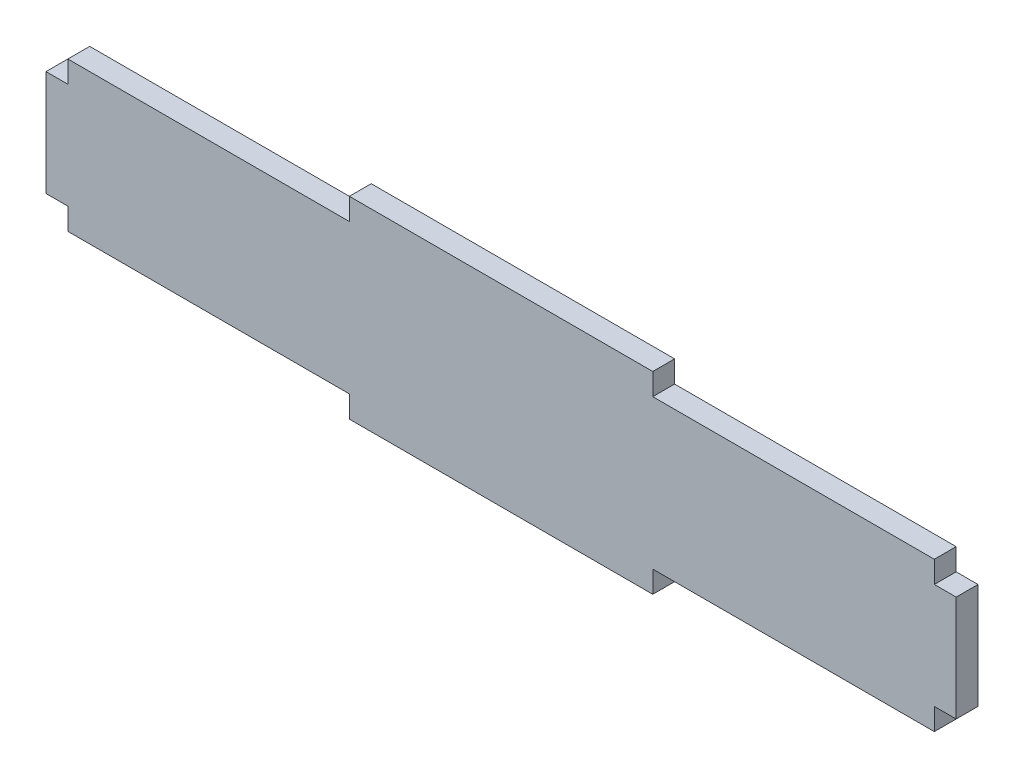
ISO-10303-21;
HEADER;
FILE_DESCRIPTION(('STEP AP214'),'2;1');
FILE_NAME('part.step','',(''),(''),'','','');
FILE_SCHEMA(('AUTOMOTIVE_DESIGN { 1 0 10303 214 1 1 1 1 }'));
ENDSEC;
DATA;
#1=APPLICATION_CONTEXT('core data for automotive mechanical design processes');
#2=APPLICATION_PROTOCOL_DEFINITION('international standard','automotive_design',2000,#1);
#3=PRODUCT_CONTEXT('',#1,'mechanical');
#4=PRODUCT('Part','Part','',(#3));
#5=PRODUCT_RELATED_PRODUCT_CATEGORY('part','',(#4));
#6=PRODUCT_DEFINITION_FORMATION('','',#4);
#7=PRODUCT_DEFINITION_CONTEXT('part definition',#1,'design');
#8=PRODUCT_DEFINITION('design','',#6,#7);
#9=PRODUCT_DEFINITION_SHAPE('','',#8);
#10=(LENGTH_UNIT() NAMED_UNIT(*) SI_UNIT(.MILLI.,.METRE.));
#11=(NAMED_UNIT(*) PLANE_ANGLE_UNIT() SI_UNIT($,.RADIAN.));
#12=(NAMED_UNIT(*) SI_UNIT($,.STERADIAN.) SOLID_ANGLE_UNIT());
#13=UNCERTAINTY_MEASURE_WITH_UNIT(LENGTH_MEASURE(1.E-05),#10,'distance_accuracy_value','');
#14=(GEOMETRIC_REPRESENTATION_CONTEXT(3) GLOBAL_UNCERTAINTY_ASSIGNED_CONTEXT((#13)) GLOBAL_UNIT_ASSIGNED_CONTEXT((#10,
#11,#12)) REPRESENTATION_CONTEXT('',''));
#15=CARTESIAN_POINT('',(0.,0.,0.));
#16=DIRECTION('',(0.,0.,1.));
#17=DIRECTION('',(1.,0.,0.));
#18=AXIS2_PLACEMENT_3D('',#15,#16,#17);
#19=CARTESIAN_POINT('',(125.,26.505,9.));
#20=DIRECTION('',(1.,0.,0.));
#21=DIRECTION('',(0.,0.,-1.));
#22=AXIS2_PLACEMENT_3D('',#19,#20,#21);
#23=PLANE('',#22);
#24=DIRECTION('',(0.,-1.,0.));
#25=VECTOR('',#24,1.);
#26=CARTESIAN_POINT('',(125.,26.505,9.));
#27=LINE('',#26,#25);
#28=CARTESIAN_POINT('',(125.,67.5149999999999,9.));
#29=VERTEX_POINT('',#28);
#30=CARTESIAN_POINT('',(125.,38.505,9.));
#31=VERTEX_POINT('',#30);
#32=EDGE_CURVE('E311',#29,#31,#27,.T.);
#33=ORIENTED_EDGE('',*,*,#32,.F.);
#34=DIRECTION('',(0.,0.,1.));
#35=VECTOR('',#34,1.);
#36=CARTESIAN_POINT('',(125.,67.5149999999999,3.));
#37=LINE('',#36,#35);
#38=CARTESIAN_POINT('',(125.,67.5149999999999,3.));
#39=VERTEX_POINT('',#38);
#40=EDGE_CURVE('E276',#39,#29,#37,.T.);
#41=ORIENTED_EDGE('',*,*,#40,.F.);
#42=DIRECTION('',(0.,-1.,0.));
#43=VECTOR('',#42,1.);
#44=CARTESIAN_POINT('',(125.,26.505,3.));
#45=LINE('',#44,#43);
#46=CARTESIAN_POINT('',(125.,38.505,3.));
#47=VERTEX_POINT('',#46);
#48=EDGE_CURVE('E309',#39,#47,#45,.T.);
#49=ORIENTED_EDGE('',*,*,#48,.T.);
#50=DIRECTION('',(0.,0.,1.));
#51=VECTOR('',#50,1.);
#52=CARTESIAN_POINT('',(125.,38.505,3.));
#53=LINE('',#52,#51);
#54=EDGE_CURVE('E280',#47,#31,#53,.T.);
#55=ORIENTED_EDGE('',*,*,#54,.T.);
#56=EDGE_LOOP('',(#33,#41,#49,#55));
#57=FACE_BOUND('',#56,.T.);
#58=ADVANCED_FACE('F34',(#57),#23,.F.);
#59=CARTESIAN_POINT('',(125.,26.505,9.));
#60=DIRECTION('',(0.,1.,0.));
#61=DIRECTION('',(0.,0.,1.));
#62=AXIS2_PLACEMENT_3D('',#59,#60,#61);
#63=PLANE('',#62);
#64=DIRECTION('',(1.,0.,0.));
#65=VECTOR('',#64,1.);
#66=CARTESIAN_POINT('',(125.,26.505,3.));
#67=LINE('',#66,#65);
#68=CARTESIAN_POINT('',(208.333333333333,26.505,3.));
#69=VERTEX_POINT('',#68);
#70=CARTESIAN_POINT('',(291.666666666667,26.505,3.));
#71=VERTEX_POINT('',#70);
#72=EDGE_CURVE('E321',#69,#71,#67,.T.);
#73=ORIENTED_EDGE('',*,*,#72,.T.);
#74=DIRECTION('',(0.,0.,1.));
#75=VECTOR('',#74,1.);
#76=CARTESIAN_POINT('',(291.666666666667,26.505,3.));
#77=LINE('',#76,#75);
#78=CARTESIAN_POINT('',(291.666666666667,26.505,9.));
#79=VERTEX_POINT('',#78);
#80=EDGE_CURVE('E177',#71,#79,#77,.T.);
#81=ORIENTED_EDGE('',*,*,#80,.T.);
#82=DIRECTION('',(1.,0.,0.));
#83=VECTOR('',#82,1.);
#84=CARTESIAN_POINT('',(125.,26.505,9.));
#85=LINE('',#84,#83);
#86=CARTESIAN_POINT('',(208.333333333333,26.505,9.));
#87=VERTEX_POINT('',#86);
#88=EDGE_CURVE('E314',#87,#79,#85,.T.);
#89=ORIENTED_EDGE('',*,*,#88,.F.);
#90=DIRECTION('',(0.,0.,1.));
#91=VECTOR('',#90,1.);
#92=CARTESIAN_POINT('',(208.333333333333,26.505,3.));
#93=LINE('',#92,#91);
#94=EDGE_CURVE('E241',#69,#87,#93,.T.);
#95=ORIENTED_EDGE('',*,*,#94,.F.);
#96=EDGE_LOOP('',(#73,#81,#89,#95));
#97=FACE_BOUND('',#96,.T.);
#98=ADVANCED_FACE('F369',(#97),#63,.F.);
#99=CARTESIAN_POINT('',(375.,26.505,9.));
#100=DIRECTION('',(-1.,0.,0.));
#101=DIRECTION('',(0.,0.,1.));
#102=AXIS2_PLACEMENT_3D('',#99,#100,#101);
#103=PLANE('',#102);
#104=DIRECTION('',(0.,1.,0.));
#105=VECTOR('',#104,1.);
#106=CARTESIAN_POINT('',(375.,26.505,3.));
#107=LINE('',#106,#105);
#108=CARTESIAN_POINT('',(375.,38.505,3.));
#109=VERTEX_POINT('',#108);
#110=CARTESIAN_POINT('',(375.,67.515,3.));
#111=VERTEX_POINT('',#110);
#112=EDGE_CURVE('E322',#109,#111,#107,.T.);
#113=ORIENTED_EDGE('',*,*,#112,.T.);
#114=DIRECTION('',(0.,0.,1.));
#115=VECTOR('',#114,1.);
#116=CARTESIAN_POINT('',(375.,67.515,3.));
#117=LINE('',#116,#115);
#118=CARTESIAN_POINT('',(375.,67.515,9.));
#119=VERTEX_POINT('',#118);
#120=EDGE_CURVE('E263',#111,#119,#117,.T.);
#121=ORIENTED_EDGE('',*,*,#120,.T.);
#122=DIRECTION('',(0.,1.,0.));
#123=VECTOR('',#122,1.);
#124=CARTESIAN_POINT('',(375.,26.505,9.));
#125=LINE('',#124,#123);
#126=CARTESIAN_POINT('',(375.,38.505,9.));
#127=VERTEX_POINT('',#126);
#128=EDGE_CURVE('E42',#127,#119,#125,.T.);
#129=ORIENTED_EDGE('',*,*,#128,.F.);
#130=DIRECTION('',(0.,0.,1.));
#131=VECTOR('',#130,1.);
#132=CARTESIAN_POINT('',(375.,38.505,3.));
#133=LINE('',#132,#131);
#134=EDGE_CURVE('E302',#109,#127,#133,.T.);
#135=ORIENTED_EDGE('',*,*,#134,.F.);
#136=EDGE_LOOP('',(#113,#121,#129,#135));
#137=FACE_BOUND('',#136,.T.);
#138=ADVANCED_FACE('F360',(#137),#103,.F.);
#139=CARTESIAN_POINT('',(125.,79.515,9.));
#140=DIRECTION('',(0.,-1.,0.));
#141=DIRECTION('',(0.,0.,-1.));
#142=AXIS2_PLACEMENT_3D('',#139,#140,#141);
#143=PLANE('',#142);
#144=DIRECTION('',(-1.,0.,0.));
#145=VECTOR('',#144,1.);
#146=CARTESIAN_POINT('',(125.,79.515,3.));
#147=LINE('',#146,#145);
#148=CARTESIAN_POINT('',(291.666666666667,79.5149999999999,3.));
#149=VERTEX_POINT('',#148);
#150=CARTESIAN_POINT('',(208.333333333333,79.5149999999999,3.));
#151=VERTEX_POINT('',#150);
#152=EDGE_CURVE('E37',#149,#151,#147,.T.);
#153=ORIENTED_EDGE('',*,*,#152,.T.);
#154=DIRECTION('',(0.,0.,1.));
#155=VECTOR('',#154,1.);
#156=CARTESIAN_POINT('',(208.333333333333,79.5149999999999,3.));
#157=LINE('',#156,#155);
#158=CARTESIAN_POINT('',(208.333333333333,79.5149999999999,9.));
#159=VERTEX_POINT('',#158);
#160=EDGE_CURVE('E196',#151,#159,#157,.T.);
#161=ORIENTED_EDGE('',*,*,#160,.T.);
#162=DIRECTION('',(-1.,0.,0.));
#163=VECTOR('',#162,1.);
#164=CARTESIAN_POINT('',(125.,79.515,9.));
#165=LINE('',#164,#163);
#166=CARTESIAN_POINT('',(291.666666666667,79.5149999999999,9.));
#167=VERTEX_POINT('',#166);
#168=EDGE_CURVE('E11',#167,#159,#165,.T.);
#169=ORIENTED_EDGE('',*,*,#168,.F.);
#170=DIRECTION('',(0.,0.,1.));
#171=VECTOR('',#170,1.);
#172=CARTESIAN_POINT('',(291.666666666667,79.5149999999999,3.));
#173=LINE('',#172,#171);
#174=EDGE_CURVE('E224',#149,#167,#173,.T.);
#175=ORIENTED_EDGE('',*,*,#174,.F.);
#176=EDGE_LOOP('',(#153,#161,#169,#175));
#177=FACE_BOUND('',#176,.T.);
#178=ADVANCED_FACE('F331',(#177),#143,.F.);
#179=CARTESIAN_POINT('',(125.,26.505,9.));
#180=DIRECTION('',(0.,0.,-1.));
#181=DIRECTION('',(-1.,0.,0.));
#182=AXIS2_PLACEMENT_3D('',#179,#180,#181);
#183=PLANE('',#182);
#184=ORIENTED_EDGE('',*,*,#88,.T.);
#185=DIRECTION('',(0.,-1.,0.));
#186=VECTOR('',#185,1.);
#187=CARTESIAN_POINT('',(291.666666666667,26.505,9.));
#188=LINE('',#187,#186);
#189=CARTESIAN_POINT('',(291.666666666667,32.505,9.));
#190=VERTEX_POINT('',#189);
#191=EDGE_CURVE('E192',#190,#79,#188,.T.);
#192=ORIENTED_EDGE('',*,*,#191,.F.);
#193=DIRECTION('',(-1.,0.,0.));
#194=VECTOR('',#193,1.);
#195=CARTESIAN_POINT('',(369.,32.505,9.));
#196=LINE('',#195,#194);
#197=CARTESIAN_POINT('',(369.,32.505,9.));
#198=VERTEX_POINT('',#197);
#199=EDGE_CURVE('E174',#198,#190,#196,.T.);
#200=ORIENTED_EDGE('',*,*,#199,.F.);
#201=DIRECTION('',(0.,-1.,0.));
#202=VECTOR('',#201,1.);
#203=CARTESIAN_POINT('',(369.,26.505,9.));
#204=LINE('',#203,#202);
#205=CARTESIAN_POINT('',(369.,38.505,9.));
#206=VERTEX_POINT('',#205);
#207=EDGE_CURVE('E300',#206,#198,#204,.T.);
#208=ORIENTED_EDGE('',*,*,#207,.F.);
#209=DIRECTION('',(-1.,0.,0.));
#210=VECTOR('',#209,1.);
#211=CARTESIAN_POINT('',(375.,38.505,9.));
#212=LINE('',#211,#210);
#213=EDGE_CURVE('E266',#127,#206,#212,.T.);
#214=ORIENTED_EDGE('',*,*,#213,.F.);
#215=ORIENTED_EDGE('',*,*,#128,.T.);
#216=DIRECTION('',(1.,0.,0.));
#217=VECTOR('',#216,1.);
#218=CARTESIAN_POINT('',(375.,67.515,9.));
#219=LINE('',#218,#217);
#220=CARTESIAN_POINT('',(369.,67.515,9.));
#221=VERTEX_POINT('',#220);
#222=EDGE_CURVE('E255',#221,#119,#219,.T.);
#223=ORIENTED_EDGE('',*,*,#222,.F.);
#224=DIRECTION('',(0.,-1.,0.));
#225=VECTOR('',#224,1.);
#226=CARTESIAN_POINT('',(369.,79.515,9.));
#227=LINE('',#226,#225);
#228=CARTESIAN_POINT('',(369.,73.5149999999999,9.));
#229=VERTEX_POINT('',#228);
#230=EDGE_CURVE('E259',#229,#221,#227,.T.);
#231=ORIENTED_EDGE('',*,*,#230,.F.);
#232=DIRECTION('',(1.,0.,0.));
#233=VECTOR('',#232,1.);
#234=CARTESIAN_POINT('',(369.,73.515,9.));
#235=LINE('',#234,#233);
#236=CARTESIAN_POINT('',(291.666666666667,73.5149999999999,9.));
#237=VERTEX_POINT('',#236);
#238=EDGE_CURVE('E221',#237,#229,#235,.T.);
#239=ORIENTED_EDGE('',*,*,#238,.F.);
#240=DIRECTION('',(0.,-1.,0.));
#241=VECTOR('',#240,1.);
#242=CARTESIAN_POINT('',(291.666666666667,79.5149999999999,9.));
#243=LINE('',#242,#241);
#244=EDGE_CURVE('E225',#167,#237,#243,.T.);
#245=ORIENTED_EDGE('',*,*,#244,.F.);
#246=ORIENTED_EDGE('',*,*,#168,.T.);
#247=DIRECTION('',(0.,1.,0.));
#248=VECTOR('',#247,1.);
#249=CARTESIAN_POINT('',(208.333333333333,79.5149999999999,9.));
#250=LINE('',#249,#248);
#251=CARTESIAN_POINT('',(208.333333333333,73.515,9.));
#252=VERTEX_POINT('',#251);
#253=EDGE_CURVE('E203',#252,#159,#250,.T.);
#254=ORIENTED_EDGE('',*,*,#253,.F.);
#255=DIRECTION('',(1.,0.,0.));
#256=VECTOR('',#255,1.);
#257=CARTESIAN_POINT('',(131.,73.515,9.));
#258=LINE('',#257,#256);
#259=CARTESIAN_POINT('',(131.,73.515,9.));
#260=VERTEX_POINT('',#259);
#261=EDGE_CURVE('E207',#260,#252,#258,.T.);
#262=ORIENTED_EDGE('',*,*,#261,.F.);
#263=DIRECTION('',(0.,1.,0.));
#264=VECTOR('',#263,1.);
#265=CARTESIAN_POINT('',(131.,79.5149999999999,9.));
#266=LINE('',#265,#264);
#267=CARTESIAN_POINT('',(131.,67.5149999999999,9.));
#268=VERTEX_POINT('',#267);
#269=EDGE_CURVE('E273',#268,#260,#266,.T.);
#270=ORIENTED_EDGE('',*,*,#269,.F.);
#271=DIRECTION('',(1.,0.,0.));
#272=VECTOR('',#271,1.);
#273=CARTESIAN_POINT('',(125.,67.5149999999999,9.));
#274=LINE('',#273,#272);
#275=EDGE_CURVE('E277',#29,#268,#274,.T.);
#276=ORIENTED_EDGE('',*,*,#275,.F.);
#277=ORIENTED_EDGE('',*,*,#32,.T.);
#278=DIRECTION('',(-1.,0.,0.));
#279=VECTOR('',#278,1.);
#280=CARTESIAN_POINT('',(125.,38.505,9.));
#281=LINE('',#280,#279);
#282=CARTESIAN_POINT('',(131.,38.505,9.));
#283=VERTEX_POINT('',#282);
#284=EDGE_CURVE('E288',#283,#31,#281,.T.);
#285=ORIENTED_EDGE('',*,*,#284,.F.);
#286=DIRECTION('',(0.,1.,0.));
#287=VECTOR('',#286,1.);
#288=CARTESIAN_POINT('',(131.,26.505,9.));
#289=LINE('',#288,#287);
#290=CARTESIAN_POINT('',(131.,32.505,9.));
#291=VERTEX_POINT('',#290);
#292=EDGE_CURVE('E248',#291,#283,#289,.T.);
#293=ORIENTED_EDGE('',*,*,#292,.F.);
#294=DIRECTION('',(-1.,0.,0.));
#295=VECTOR('',#294,1.);
#296=CARTESIAN_POINT('',(131.,32.505,9.));
#297=LINE('',#296,#295);
#298=CARTESIAN_POINT('',(208.333333333333,32.505,9.));
#299=VERTEX_POINT('',#298);
#300=EDGE_CURVE('E238',#299,#291,#297,.T.);
#301=ORIENTED_EDGE('',*,*,#300,.F.);
#302=DIRECTION('',(0.,1.,0.));
#303=VECTOR('',#302,1.);
#304=CARTESIAN_POINT('',(208.333333333333,26.505,9.));
#305=LINE('',#304,#303);
#306=EDGE_CURVE('E198',#87,#299,#305,.T.);
#307=ORIENTED_EDGE('',*,*,#306,.F.);
#308=EDGE_LOOP('',(#184,#192,#200,#208,#214,#215,#223,#231,#239,#245,#246,#254,#262,#270,#276,
#277,#285,#293,#301,#307));
#309=FACE_BOUND('',#308,.T.);
#310=ADVANCED_FACE('F339',(#309),#183,.F.);
#311=CARTESIAN_POINT('',(125.,26.505,3.));
#312=DIRECTION('',(0.,0.,-1.));
#313=DIRECTION('',(-1.,0.,0.));
#314=AXIS2_PLACEMENT_3D('',#311,#312,#313);
#315=PLANE('',#314);
#316=DIRECTION('',(0.,-1.,0.));
#317=VECTOR('',#316,1.);
#318=CARTESIAN_POINT('',(291.666666666667,26.505,3.));
#319=LINE('',#318,#317);
#320=CARTESIAN_POINT('',(291.666666666667,32.505,3.));
#321=VERTEX_POINT('',#320);
#322=EDGE_CURVE('E181',#321,#71,#319,.T.);
#323=ORIENTED_EDGE('',*,*,#322,.T.);
#324=ORIENTED_EDGE('',*,*,#72,.F.);
#325=DIRECTION('',(0.,1.,0.));
#326=VECTOR('',#325,1.);
#327=CARTESIAN_POINT('',(208.333333333333,26.505,3.));
#328=LINE('',#327,#326);
#329=CARTESIAN_POINT('',(208.333333333333,32.505,3.));
#330=VERTEX_POINT('',#329);
#331=EDGE_CURVE('E234',#69,#330,#328,.T.);
#332=ORIENTED_EDGE('',*,*,#331,.T.);
#333=DIRECTION('',(-1.,0.,0.));
#334=VECTOR('',#333,1.);
#335=CARTESIAN_POINT('',(131.,32.505,3.));
#336=LINE('',#335,#334);
#337=CARTESIAN_POINT('',(131.,32.505,3.));
#338=VERTEX_POINT('',#337);
#339=EDGE_CURVE('E237',#330,#338,#336,.T.);
#340=ORIENTED_EDGE('',*,*,#339,.T.);
#341=DIRECTION('',(0.,1.,0.));
#342=VECTOR('',#341,1.);
#343=CARTESIAN_POINT('',(131.,26.505,3.));
#344=LINE('',#343,#342);
#345=CARTESIAN_POINT('',(131.,38.505,3.));
#346=VERTEX_POINT('',#345);
#347=EDGE_CURVE('E285',#338,#346,#344,.T.);
#348=ORIENTED_EDGE('',*,*,#347,.T.);
#349=DIRECTION('',(-1.,0.,0.));
#350=VECTOR('',#349,1.);
#351=CARTESIAN_POINT('',(125.,38.505,3.));
#352=LINE('',#351,#350);
#353=EDGE_CURVE('E287',#346,#47,#352,.T.);
#354=ORIENTED_EDGE('',*,*,#353,.T.);
#355=ORIENTED_EDGE('',*,*,#48,.F.);
#356=DIRECTION('',(1.,0.,0.));
#357=VECTOR('',#356,1.);
#358=CARTESIAN_POINT('',(125.,67.5149999999999,3.));
#359=LINE('',#358,#357);
#360=CARTESIAN_POINT('',(131.,67.5149999999999,3.));
#361=VERTEX_POINT('',#360);
#362=EDGE_CURVE('E269',#39,#361,#359,.T.);
#363=ORIENTED_EDGE('',*,*,#362,.T.);
#364=DIRECTION('',(0.,1.,0.));
#365=VECTOR('',#364,1.);
#366=CARTESIAN_POINT('',(131.,79.5149999999999,3.));
#367=LINE('',#366,#365);
#368=CARTESIAN_POINT('',(131.,73.515,3.));
#369=VERTEX_POINT('',#368);
#370=EDGE_CURVE('E272',#361,#369,#367,.T.);
#371=ORIENTED_EDGE('',*,*,#370,.T.);
#372=DIRECTION('',(1.,0.,0.));
#373=VECTOR('',#372,1.);
#374=CARTESIAN_POINT('',(131.,73.515,3.));
#375=LINE('',#374,#373);
#376=CARTESIAN_POINT('',(208.333333333333,73.515,3.));
#377=VERTEX_POINT('',#376);
#378=EDGE_CURVE('E58',#369,#377,#375,.T.);
#379=ORIENTED_EDGE('',*,*,#378,.T.);
#380=DIRECTION('',(0.,1.,0.));
#381=VECTOR('',#380,1.);
#382=CARTESIAN_POINT('',(208.333333333333,79.5149999999999,3.));
#383=LINE('',#382,#381);
#384=EDGE_CURVE('E202',#377,#151,#383,.T.);
#385=ORIENTED_EDGE('',*,*,#384,.T.);
#386=ORIENTED_EDGE('',*,*,#152,.F.);
#387=DIRECTION('',(0.,-1.,0.));
#388=VECTOR('',#387,1.);
#389=CARTESIAN_POINT('',(291.666666666667,79.5149999999999,3.));
#390=LINE('',#389,#388);
#391=CARTESIAN_POINT('',(291.666666666667,73.5149999999999,3.));
#392=VERTEX_POINT('',#391);
#393=EDGE_CURVE('E217',#149,#392,#390,.T.);
#394=ORIENTED_EDGE('',*,*,#393,.T.);
#395=DIRECTION('',(1.,0.,0.));
#396=VECTOR('',#395,1.);
#397=CARTESIAN_POINT('',(369.,73.515,3.));
#398=LINE('',#397,#396);
#399=CARTESIAN_POINT('',(369.,73.515,3.));
#400=VERTEX_POINT('',#399);
#401=EDGE_CURVE('E220',#392,#400,#398,.T.);
#402=ORIENTED_EDGE('',*,*,#401,.T.);
#403=DIRECTION('',(0.,-1.,0.));
#404=VECTOR('',#403,1.);
#405=CARTESIAN_POINT('',(369.,79.515,3.));
#406=LINE('',#405,#404);
#407=CARTESIAN_POINT('',(369.,67.515,3.));
#408=VERTEX_POINT('',#407);
#409=EDGE_CURVE('E252',#400,#408,#406,.T.);
#410=ORIENTED_EDGE('',*,*,#409,.T.);
#411=DIRECTION('',(1.,0.,0.));
#412=VECTOR('',#411,1.);
#413=CARTESIAN_POINT('',(375.,67.515,3.));
#414=LINE('',#413,#412);
#415=EDGE_CURVE('E254',#408,#111,#414,.T.);
#416=ORIENTED_EDGE('',*,*,#415,.T.);
#417=ORIENTED_EDGE('',*,*,#112,.F.);
#418=DIRECTION('',(-1.,0.,0.));
#419=VECTOR('',#418,1.);
#420=CARTESIAN_POINT('',(375.,38.505,3.));
#421=LINE('',#420,#419);
#422=CARTESIAN_POINT('',(369.,38.505,3.));
#423=VERTEX_POINT('',#422);
#424=EDGE_CURVE('E298',#109,#423,#421,.T.);
#425=ORIENTED_EDGE('',*,*,#424,.T.);
#426=DIRECTION('',(0.,-1.,0.));
#427=VECTOR('',#426,1.);
#428=CARTESIAN_POINT('',(369.,26.505,3.));
#429=LINE('',#428,#427);
#430=CARTESIAN_POINT('',(369.,32.505,3.));
#431=VERTEX_POINT('',#430);
#432=EDGE_CURVE('E191',#423,#431,#429,.T.);
#433=ORIENTED_EDGE('',*,*,#432,.T.);
#434=DIRECTION('',(-1.,0.,0.));
#435=VECTOR('',#434,1.);
#436=CARTESIAN_POINT('',(369.,32.505,3.));
#437=LINE('',#436,#435);
#438=EDGE_CURVE('E50',#431,#321,#437,.T.);
#439=ORIENTED_EDGE('',*,*,#438,.T.);
#440=EDGE_LOOP('',(#323,#324,#332,#340,#348,#354,#355,#363,#371,#379,#385,#386,#394,#402,#410,
#416,#417,#425,#433,#439));
#441=FACE_BOUND('',#440,.T.);
#442=ADVANCED_FACE('F189',(#441),#315,.T.);
#443=CARTESIAN_POINT('',(369.,26.505,3.));
#444=DIRECTION('',(-1.,0.,0.));
#445=DIRECTION('',(0.,0.,1.));
#446=AXIS2_PLACEMENT_3D('',#443,#444,#445);
#447=PLANE('',#446);
#448=ORIENTED_EDGE('',*,*,#207,.T.);
#449=DIRECTION('',(0.,0.,1.));
#450=VECTOR('',#449,1.);
#451=CARTESIAN_POINT('',(369.,32.505,3.));
#452=LINE('',#451,#450);
#453=EDGE_CURVE('E178',#431,#198,#452,.T.);
#454=ORIENTED_EDGE('',*,*,#453,.F.);
#455=ORIENTED_EDGE('',*,*,#432,.F.);
#456=DIRECTION('',(0.,0.,1.));
#457=VECTOR('',#456,1.);
#458=CARTESIAN_POINT('',(369.,38.505,3.));
#459=LINE('',#458,#457);
#460=EDGE_CURVE('E307',#423,#206,#459,.T.);
#461=ORIENTED_EDGE('',*,*,#460,.T.);
#462=EDGE_LOOP('',(#448,#454,#455,#461));
#463=FACE_BOUND('',#462,.T.);
#464=ADVANCED_FACE('F365',(#463),#447,.F.);
#465=CARTESIAN_POINT('',(375.,38.505,3.));
#466=DIRECTION('',(0.,1.,0.));
#467=DIRECTION('',(0.,0.,1.));
#468=AXIS2_PLACEMENT_3D('',#465,#466,#467);
#469=PLANE('',#468);
#470=ORIENTED_EDGE('',*,*,#213,.T.);
#471=ORIENTED_EDGE('',*,*,#460,.F.);
#472=ORIENTED_EDGE('',*,*,#424,.F.);
#473=ORIENTED_EDGE('',*,*,#134,.T.);
#474=EDGE_LOOP('',(#470,#471,#472,#473));
#475=FACE_BOUND('',#474,.T.);
#476=ADVANCED_FACE('F363',(#475),#469,.F.);
#477=CARTESIAN_POINT('',(125.,38.505,3.));
#478=DIRECTION('',(0.,1.,0.));
#479=DIRECTION('',(0.,0.,1.));
#480=AXIS2_PLACEMENT_3D('',#477,#478,#479);
#481=PLANE('',#480);
#482=ORIENTED_EDGE('',*,*,#284,.T.);
#483=ORIENTED_EDGE('',*,*,#54,.F.);
#484=ORIENTED_EDGE('',*,*,#353,.F.);
#485=DIRECTION('',(0.,0.,1.));
#486=VECTOR('',#485,1.);
#487=CARTESIAN_POINT('',(131.,38.505,3.));
#488=LINE('',#487,#486);
#489=EDGE_CURVE('E291',#346,#283,#488,.T.);
#490=ORIENTED_EDGE('',*,*,#489,.T.);
#491=EDGE_LOOP('',(#482,#483,#484,#490));
#492=FACE_BOUND('',#491,.T.);
#493=ADVANCED_FACE('F386',(#492),#481,.F.);
#494=CARTESIAN_POINT('',(131.,26.505,3.));
#495=DIRECTION('',(1.,0.,0.));
#496=DIRECTION('',(0.,1.,0.));
#497=AXIS2_PLACEMENT_3D('',#494,#495,#496);
#498=PLANE('',#497);
#499=ORIENTED_EDGE('',*,*,#347,.F.);
#500=DIRECTION('',(0.,0.,1.));
#501=VECTOR('',#500,1.);
#502=CARTESIAN_POINT('',(131.,32.505,3.));
#503=LINE('',#502,#501);
#504=EDGE_CURVE('E245',#338,#291,#503,.T.);
#505=ORIENTED_EDGE('',*,*,#504,.T.);
#506=ORIENTED_EDGE('',*,*,#292,.T.);
#507=ORIENTED_EDGE('',*,*,#489,.F.);
#508=EDGE_LOOP('',(#499,#505,#506,#507));
#509=FACE_BOUND('',#508,.T.);
#510=ADVANCED_FACE('F380',(#509),#498,.F.);
#511=CARTESIAN_POINT('',(131.,79.5149999999999,3.));
#512=DIRECTION('',(1.,0.,0.));
#513=DIRECTION('',(0.,1.,0.));
#514=AXIS2_PLACEMENT_3D('',#511,#512,#513);
#515=PLANE('',#514);
#516=ORIENTED_EDGE('',*,*,#269,.T.);
#517=DIRECTION('',(0.,0.,1.));
#518=VECTOR('',#517,1.);
#519=CARTESIAN_POINT('',(131.,73.515,3.));
#520=LINE('',#519,#518);
#521=EDGE_CURVE('E206',#369,#260,#520,.T.);
#522=ORIENTED_EDGE('',*,*,#521,.F.);
#523=ORIENTED_EDGE('',*,*,#370,.F.);
#524=DIRECTION('',(0.,0.,1.));
#525=VECTOR('',#524,1.);
#526=CARTESIAN_POINT('',(131.,67.5149999999999,3.));
#527=LINE('',#526,#525);
#528=EDGE_CURVE('E261',#361,#268,#527,.T.);
#529=ORIENTED_EDGE('',*,*,#528,.T.);
#530=EDGE_LOOP('',(#516,#522,#523,#529));
#531=FACE_BOUND('',#530,.T.);
#532=ADVANCED_FACE('F395',(#531),#515,.F.);
#533=CARTESIAN_POINT('',(125.,67.5149999999999,3.));
#534=DIRECTION('',(0.,-1.,0.));
#535=DIRECTION('',(1.,0.,0.));
#536=AXIS2_PLACEMENT_3D('',#533,#534,#535);
#537=PLANE('',#536);
#538=ORIENTED_EDGE('',*,*,#275,.T.);
#539=ORIENTED_EDGE('',*,*,#528,.F.);
#540=ORIENTED_EDGE('',*,*,#362,.F.);
#541=ORIENTED_EDGE('',*,*,#40,.T.);
#542=EDGE_LOOP('',(#538,#539,#540,#541));
#543=FACE_BOUND('',#542,.T.);
#544=ADVANCED_FACE('F393',(#543),#537,.F.);
#545=CARTESIAN_POINT('',(375.,67.515,3.));
#546=DIRECTION('',(0.,-1.,0.));
#547=DIRECTION('',(0.,0.,-1.));
#548=AXIS2_PLACEMENT_3D('',#545,#546,#547);
#549=PLANE('',#548);
#550=ORIENTED_EDGE('',*,*,#222,.T.);
#551=ORIENTED_EDGE('',*,*,#120,.F.);
#552=ORIENTED_EDGE('',*,*,#415,.F.);
#553=DIRECTION('',(0.,0.,1.));
#554=VECTOR('',#553,1.);
#555=CARTESIAN_POINT('',(369.,67.515,3.));
#556=LINE('',#555,#554);
#557=EDGE_CURVE('E258',#408,#221,#556,.T.);
#558=ORIENTED_EDGE('',*,*,#557,.T.);
#559=EDGE_LOOP('',(#550,#551,#552,#558));
#560=FACE_BOUND('',#559,.T.);
#561=ADVANCED_FACE('F356',(#560),#549,.F.);
#562=CARTESIAN_POINT('',(369.,79.515,3.));
#563=DIRECTION('',(-1.,0.,0.));
#564=DIRECTION('',(0.,0.,1.));
#565=AXIS2_PLACEMENT_3D('',#562,#563,#564);
#566=PLANE('',#565);
#567=ORIENTED_EDGE('',*,*,#409,.F.);
#568=DIRECTION('',(0.,0.,1.));
#569=VECTOR('',#568,1.);
#570=CARTESIAN_POINT('',(369.,73.515,3.));
#571=LINE('',#570,#569);
#572=EDGE_CURVE('E210',#400,#229,#571,.T.);
#573=ORIENTED_EDGE('',*,*,#572,.T.);
#574=ORIENTED_EDGE('',*,*,#230,.T.);
#575=ORIENTED_EDGE('',*,*,#557,.F.);
#576=EDGE_LOOP('',(#567,#573,#574,#575));
#577=FACE_BOUND('',#576,.T.);
#578=ADVANCED_FACE('F353',(#577),#566,.F.);
#579=CARTESIAN_POINT('',(131.,32.505,3.));
#580=DIRECTION('',(0.,1.,0.));
#581=DIRECTION('',(0.,0.,1.));
#582=AXIS2_PLACEMENT_3D('',#579,#580,#581);
#583=PLANE('',#582);
#584=ORIENTED_EDGE('',*,*,#300,.T.);
#585=ORIENTED_EDGE('',*,*,#504,.F.);
#586=ORIENTED_EDGE('',*,*,#339,.F.);
#587=DIRECTION('',(0.,0.,1.));
#588=VECTOR('',#587,1.);
#589=CARTESIAN_POINT('',(208.333333333333,32.505,3.));
#590=LINE('',#589,#588);
#591=EDGE_CURVE('E249',#330,#299,#590,.T.);
#592=ORIENTED_EDGE('',*,*,#591,.T.);
#593=EDGE_LOOP('',(#584,#585,#586,#592));
#594=FACE_BOUND('',#593,.T.);
#595=ADVANCED_FACE('F377',(#594),#583,.F.);
#596=CARTESIAN_POINT('',(208.333333333333,26.505,3.));
#597=DIRECTION('',(1.,0.,0.));
#598=DIRECTION('',(0.,0.,-1.));
#599=AXIS2_PLACEMENT_3D('',#596,#597,#598);
#600=PLANE('',#599);
#601=ORIENTED_EDGE('',*,*,#306,.T.);
#602=ORIENTED_EDGE('',*,*,#591,.F.);
#603=ORIENTED_EDGE('',*,*,#331,.F.);
#604=ORIENTED_EDGE('',*,*,#94,.T.);
#605=EDGE_LOOP('',(#601,#602,#603,#604));
#606=FACE_BOUND('',#605,.T.);
#607=ADVANCED_FACE('F374',(#606),#600,.F.);
#608=CARTESIAN_POINT('',(369.,73.515,3.));
#609=DIRECTION('',(0.,-1.,0.));
#610=DIRECTION('',(1.,0.,0.));
#611=AXIS2_PLACEMENT_3D('',#608,#609,#610);
#612=PLANE('',#611);
#613=ORIENTED_EDGE('',*,*,#238,.T.);
#614=ORIENTED_EDGE('',*,*,#572,.F.);
#615=ORIENTED_EDGE('',*,*,#401,.F.);
#616=DIRECTION('',(0.,0.,1.));
#617=VECTOR('',#616,1.);
#618=CARTESIAN_POINT('',(291.666666666667,73.5149999999999,3.));
#619=LINE('',#618,#617);
#620=EDGE_CURVE('E231',#392,#237,#619,.T.);
#621=ORIENTED_EDGE('',*,*,#620,.T.);
#622=EDGE_LOOP('',(#613,#614,#615,#621));
#623=FACE_BOUND('',#622,.T.);
#624=ADVANCED_FACE('F348',(#623),#612,.F.);
#625=CARTESIAN_POINT('',(291.666666666667,79.5149999999999,3.));
#626=DIRECTION('',(-1.,0.,0.));
#627=DIRECTION('',(0.,0.,1.));
#628=AXIS2_PLACEMENT_3D('',#625,#626,#627);
#629=PLANE('',#628);
#630=ORIENTED_EDGE('',*,*,#244,.T.);
#631=ORIENTED_EDGE('',*,*,#620,.F.);
#632=ORIENTED_EDGE('',*,*,#393,.F.);
#633=ORIENTED_EDGE('',*,*,#174,.T.);
#634=EDGE_LOOP('',(#630,#631,#632,#633));
#635=FACE_BOUND('',#634,.T.);
#636=ADVANCED_FACE('F345',(#635),#629,.F.);
#637=CARTESIAN_POINT('',(208.333333333333,79.5149999999999,3.));
#638=DIRECTION('',(1.,0.,0.));
#639=DIRECTION('',(0.,0.,-1.));
#640=AXIS2_PLACEMENT_3D('',#637,#638,#639);
#641=PLANE('',#640);
#642=ORIENTED_EDGE('',*,*,#253,.T.);
#643=ORIENTED_EDGE('',*,*,#160,.F.);
#644=ORIENTED_EDGE('',*,*,#384,.F.);
#645=DIRECTION('',(0.,0.,1.));
#646=VECTOR('',#645,1.);
#647=CARTESIAN_POINT('',(208.333333333333,73.515,3.));
#648=LINE('',#647,#646);
#649=EDGE_CURVE('E214',#377,#252,#648,.T.);
#650=ORIENTED_EDGE('',*,*,#649,.T.);
#651=EDGE_LOOP('',(#642,#643,#644,#650));
#652=FACE_BOUND('',#651,.T.);
#653=ADVANCED_FACE('F335',(#652),#641,.F.);
#654=CARTESIAN_POINT('',(131.,73.515,3.));
#655=DIRECTION('',(0.,-1.,0.));
#656=DIRECTION('',(0.,0.,-1.));
#657=AXIS2_PLACEMENT_3D('',#654,#655,#656);
#658=PLANE('',#657);
#659=ORIENTED_EDGE('',*,*,#261,.T.);
#660=ORIENTED_EDGE('',*,*,#649,.F.);
#661=ORIENTED_EDGE('',*,*,#378,.F.);
#662=ORIENTED_EDGE('',*,*,#521,.T.);
#663=EDGE_LOOP('',(#659,#660,#661,#662));
#664=FACE_BOUND('',#663,.T.);
#665=ADVANCED_FACE('F396',(#664),#658,.F.);
#666=CARTESIAN_POINT('',(291.666666666667,26.505,3.));
#667=DIRECTION('',(-1.,0.,0.));
#668=DIRECTION('',(0.,0.,1.));
#669=AXIS2_PLACEMENT_3D('',#666,#667,#668);
#670=PLANE('',#669);
#671=ORIENTED_EDGE('',*,*,#191,.T.);
#672=ORIENTED_EDGE('',*,*,#80,.F.);
#673=ORIENTED_EDGE('',*,*,#322,.F.);
#674=DIRECTION('',(0.,0.,1.));
#675=VECTOR('',#674,1.);
#676=CARTESIAN_POINT('',(291.666666666667,32.505,3.));
#677=LINE('',#676,#675);
#678=EDGE_CURVE('E170',#321,#190,#677,.T.);
#679=ORIENTED_EDGE('',*,*,#678,.T.);
#680=EDGE_LOOP('',(#671,#672,#673,#679));
#681=FACE_BOUND('',#680,.T.);
#682=ADVANCED_FACE('F182',(#681),#670,.F.);
#683=CARTESIAN_POINT('',(369.,32.505,3.));
#684=DIRECTION('',(0.,1.,0.));
#685=DIRECTION('',(-1.,0.,0.));
#686=AXIS2_PLACEMENT_3D('',#683,#684,#685);
#687=PLANE('',#686);
#688=ORIENTED_EDGE('',*,*,#199,.T.);
#689=ORIENTED_EDGE('',*,*,#678,.F.);
#690=ORIENTED_EDGE('',*,*,#438,.F.);
#691=ORIENTED_EDGE('',*,*,#453,.T.);
#692=EDGE_LOOP('',(#688,#689,#690,#691));
#693=FACE_BOUND('',#692,.T.);
#694=ADVANCED_FACE('F172',(#693),#687,.F.);
#695=CLOSED_SHELL('',(#58,#98,#138,#178,#310,#442,#464,#476,#493,#510,#532,#544,#561,#578,#595,
#607,#624,#636,#653,#665,#682,#694));
#696=MANIFOLD_SOLID_BREP('B2',#695);
#697=ADVANCED_BREP_SHAPE_REPRESENTATION('',(#18,#696),#14);
#698=SHAPE_DEFINITION_REPRESENTATION(#9,#697);
ENDSEC;
END-ISO-10303-21;
